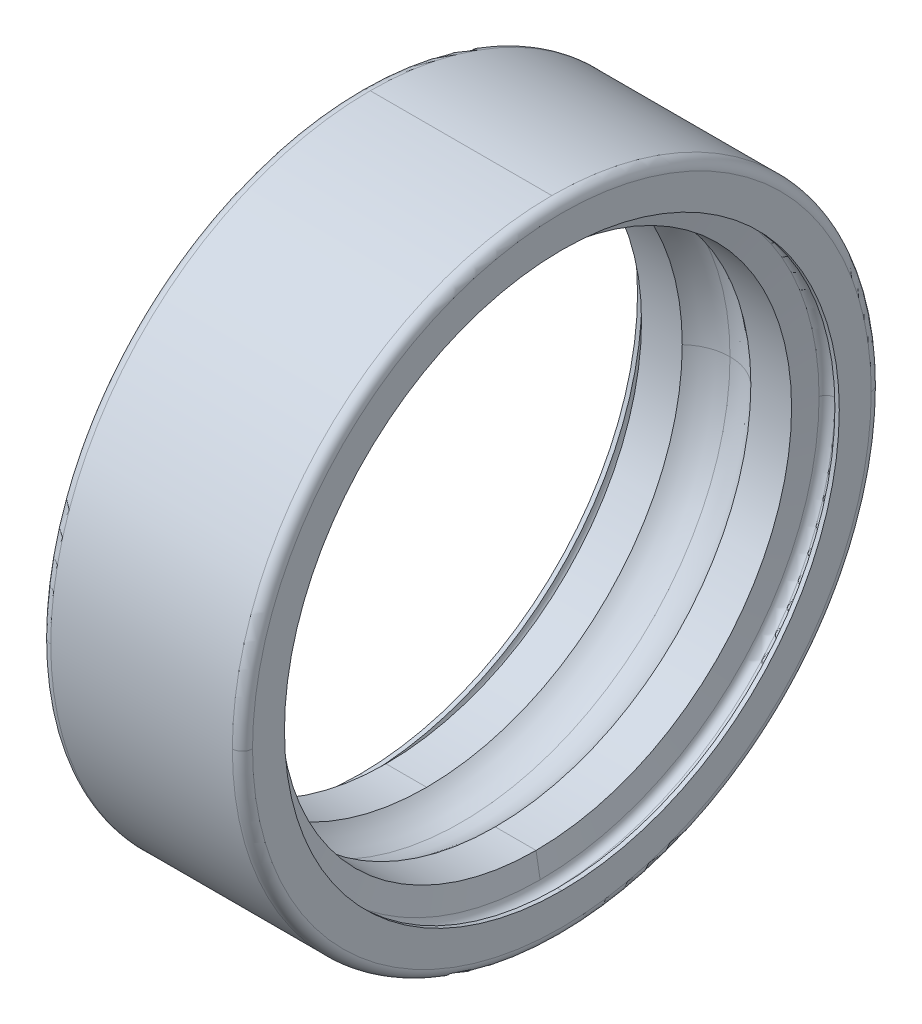
ISO-10303-21;
HEADER;
FILE_DESCRIPTION(('STEP AP214'),'2;1');
FILE_NAME('part.step','',(''),(''),'','','');
FILE_SCHEMA(('AUTOMOTIVE_DESIGN { 1 0 10303 214 1 1 1 1 }'));
ENDSEC;
DATA;
#1=APPLICATION_CONTEXT('core data for automotive mechanical design processes');
#2=APPLICATION_PROTOCOL_DEFINITION('international standard','automotive_design',2000,#1);
#3=PRODUCT_CONTEXT('',#1,'mechanical');
#4=PRODUCT('Part','Part','',(#3));
#5=PRODUCT_RELATED_PRODUCT_CATEGORY('part','',(#4));
#6=PRODUCT_DEFINITION_FORMATION('','',#4);
#7=PRODUCT_DEFINITION_CONTEXT('part definition',#1,'design');
#8=PRODUCT_DEFINITION('design','',#6,#7);
#9=PRODUCT_DEFINITION_SHAPE('','',#8);
#10=(LENGTH_UNIT() NAMED_UNIT(*) SI_UNIT(.MILLI.,.METRE.));
#11=(NAMED_UNIT(*) PLANE_ANGLE_UNIT() SI_UNIT($,.RADIAN.));
#12=(NAMED_UNIT(*) SI_UNIT($,.STERADIAN.) SOLID_ANGLE_UNIT());
#13=UNCERTAINTY_MEASURE_WITH_UNIT(LENGTH_MEASURE(1.E-05),#10,'distance_accuracy_value','');
#14=(GEOMETRIC_REPRESENTATION_CONTEXT(3) GLOBAL_UNCERTAINTY_ASSIGNED_CONTEXT((#13)) GLOBAL_UNIT_ASSIGNED_CONTEXT((#10,
#11,#12)) REPRESENTATION_CONTEXT('',''));
#15=CARTESIAN_POINT('',(0.,0.,0.));
#16=DIRECTION('',(0.,0.,1.));
#17=DIRECTION('',(1.,0.,0.));
#18=AXIS2_PLACEMENT_3D('',#15,#16,#17);
#19=CARTESIAN_POINT('',(5.61,0.,0.));
#20=DIRECTION('',(1.,0.,0.));
#21=DIRECTION('',(0.,0.,-1.));
#22=AXIS2_PLACEMENT_3D('',#19,#20,#21);
#23=TOROIDAL_SURFACE('',#22,8.25,0.26);
#24=CARTESIAN_POINT('',(5.61,0.,0.));
#25=DIRECTION('',(1.,0.,0.));
#26=DIRECTION('',(0.,0.,1.));
#27=AXIS2_PLACEMENT_3D('',#24,#25,#26);
#28=CIRCLE('',#27,8.51);
#29=CARTESIAN_POINT('',(5.61,0.,-8.51));
#30=VERTEX_POINT('',#29);
#31=CARTESIAN_POINT('',(5.61,0.,8.51));
#32=VERTEX_POINT('',#31);
#33=EDGE_CURVE('E185',#30,#32,#28,.T.);
#34=ORIENTED_EDGE('',*,*,#33,.T.);
#35=CARTESIAN_POINT('',(5.61,0.,8.25));
#36=DIRECTION('',(0.,-1.,0.));
#37=DIRECTION('',(0.,0.,1.));
#38=AXIS2_PLACEMENT_3D('',#35,#36,#37);
#39=CIRCLE('',#38,0.26);
#40=CARTESIAN_POINT('',(5.35394998421683,0.,8.2951485261934));
#41=VERTEX_POINT('',#40);
#42=EDGE_CURVE('E198',#32,#41,#39,.T.);
#43=ORIENTED_EDGE('',*,*,#42,.T.);
#44=CARTESIAN_POINT('',(5.35394998421683,0.,0.));
#45=DIRECTION('',(1.,0.,0.));
#46=DIRECTION('',(0.,1.,0.));
#47=AXIS2_PLACEMENT_3D('',#44,#45,#46);
#48=CIRCLE('',#47,8.2951485261934);
#49=CARTESIAN_POINT('',(5.35394998421683,8.2951485261934,0.));
#50=VERTEX_POINT('',#49);
#51=EDGE_CURVE('E32',#50,#41,#48,.T.);
#52=ORIENTED_EDGE('',*,*,#51,.F.);
#53=CARTESIAN_POINT('',(5.35394998421683,0.,0.));
#54=DIRECTION('',(1.,0.,0.));
#55=DIRECTION('',(0.,1.,0.));
#56=AXIS2_PLACEMENT_3D('',#53,#54,#55);
#57=CIRCLE('',#56,8.2951485261934);
#58=CARTESIAN_POINT('',(5.35394998421683,0.,-8.2951485261934));
#59=VERTEX_POINT('',#58);
#60=EDGE_CURVE('E186',#59,#50,#57,.T.);
#61=ORIENTED_EDGE('',*,*,#60,.F.);
#62=CARTESIAN_POINT('',(5.61,0.,-8.25));
#63=DIRECTION('',(0.,-1.,0.));
#64=DIRECTION('',(0.,0.,-1.));
#65=AXIS2_PLACEMENT_3D('',#62,#63,#64);
#66=CIRCLE('',#65,0.26);
#67=EDGE_CURVE('E182',#59,#30,#66,.T.);
#68=ORIENTED_EDGE('',*,*,#67,.T.);
#69=EDGE_LOOP('',(#34,#43,#52,#61,#68));
#70=FACE_BOUND('',#69,.T.);
#71=ADVANCED_FACE('F17',(#70),#23,.F.);
#72=CARTESIAN_POINT('',(5.935,0.,0.));
#73=DIRECTION('',(1.,0.,0.));
#74=DIRECTION('',(0.,1.,0.));
#75=AXIS2_PLACEMENT_3D('',#72,#73,#74);
#76=CYLINDRICAL_SURFACE('',#75,8.25);
#77=DIRECTION('',(1.,0.,0.));
#78=VECTOR('',#77,1.);
#79=CARTESIAN_POINT('',(5.935,8.25,0.));
#80=LINE('',#79,#78);
#81=CARTESIAN_POINT('',(5.87,8.25,0.));
#82=VERTEX_POINT('',#81);
#83=CARTESIAN_POINT('',(6.,8.25,0.));
#84=VERTEX_POINT('',#83);
#85=EDGE_CURVE('E328',#82,#84,#80,.T.);
#86=ORIENTED_EDGE('',*,*,#85,.T.);
#87=CARTESIAN_POINT('',(6.,0.,0.));
#88=DIRECTION('',(1.,0.,0.));
#89=DIRECTION('',(0.,1.,0.));
#90=AXIS2_PLACEMENT_3D('',#87,#88,#89);
#91=CIRCLE('',#90,8.25);
#92=CARTESIAN_POINT('',(6.,-8.25,0.));
#93=VERTEX_POINT('',#92);
#94=EDGE_CURVE('E11',#84,#93,#91,.T.);
#95=ORIENTED_EDGE('',*,*,#94,.T.);
#96=DIRECTION('',(-1.,0.,0.));
#97=VECTOR('',#96,1.);
#98=CARTESIAN_POINT('',(5.935,-8.25,0.));
#99=LINE('',#98,#97);
#100=CARTESIAN_POINT('',(5.87,-8.25,0.));
#101=VERTEX_POINT('',#100);
#102=EDGE_CURVE('E335',#93,#101,#99,.T.);
#103=ORIENTED_EDGE('',*,*,#102,.T.);
#104=CARTESIAN_POINT('',(5.87,0.,0.));
#105=DIRECTION('',(1.,0.,0.));
#106=DIRECTION('',(0.,1.,0.));
#107=AXIS2_PLACEMENT_3D('',#104,#105,#106);
#108=CIRCLE('',#107,8.25);
#109=CARTESIAN_POINT('',(5.87,0.,8.25));
#110=VERTEX_POINT('',#109);
#111=EDGE_CURVE('E202',#110,#101,#108,.T.);
#112=ORIENTED_EDGE('',*,*,#111,.F.);
#113=CARTESIAN_POINT('',(5.87,0.,0.));
#114=DIRECTION('',(1.,0.,0.));
#115=DIRECTION('',(0.,1.,0.));
#116=AXIS2_PLACEMENT_3D('',#113,#114,#115);
#117=CIRCLE('',#116,8.25);
#118=EDGE_CURVE('E239',#82,#110,#117,.T.);
#119=ORIENTED_EDGE('',*,*,#118,.F.);
#120=EDGE_LOOP('',(#86,#95,#103,#112,#119));
#121=FACE_BOUND('',#120,.T.);
#122=ADVANCED_FACE('F421',(#121),#76,.F.);
#123=CARTESIAN_POINT('',(6.,8.725,0.));
#124=DIRECTION('',(1.,0.,0.));
#125=DIRECTION('',(0.,1.,0.));
#126=AXIS2_PLACEMENT_3D('',#123,#124,#125);
#127=PLANE('',#126);
#128=ORIENTED_EDGE('',*,*,#94,.F.);
#129=CARTESIAN_POINT('',(6.,0.,0.));
#130=DIRECTION('',(1.,0.,0.));
#131=DIRECTION('',(0.,1.,0.));
#132=AXIS2_PLACEMENT_3D('',#129,#130,#131);
#133=CIRCLE('',#132,8.25);
#134=EDGE_CURVE('E339',#93,#84,#133,.T.);
#135=ORIENTED_EDGE('',*,*,#134,.F.);
#136=EDGE_LOOP('',(#128,#135));
#137=FACE_BOUND('',#136,.T.);
#138=CARTESIAN_POINT('',(6.,0.,0.));
#139=DIRECTION('',(1.,0.,0.));
#140=DIRECTION('',(0.,1.,0.));
#141=AXIS2_PLACEMENT_3D('',#138,#139,#140);
#142=CIRCLE('',#141,9.2);
#143=CARTESIAN_POINT('',(6.,0.,9.2));
#144=VERTEX_POINT('',#143);
#145=CARTESIAN_POINT('',(6.,0.,-9.2));
#146=VERTEX_POINT('',#145);
#147=EDGE_CURVE('E20',#144,#146,#142,.T.);
#148=ORIENTED_EDGE('',*,*,#147,.T.);
#149=CARTESIAN_POINT('',(6.,0.,0.));
#150=DIRECTION('',(1.,0.,0.));
#151=DIRECTION('',(0.,1.,0.));
#152=AXIS2_PLACEMENT_3D('',#149,#150,#151);
#153=CIRCLE('',#152,9.2);
#154=EDGE_CURVE('E258',#146,#144,#153,.T.);
#155=ORIENTED_EDGE('',*,*,#154,.T.);
#156=EDGE_LOOP('',(#148,#155));
#157=FACE_BOUND('',#156,.T.);
#158=ADVANCED_FACE('F404',(#137,#157),#127,.T.);
#159=CARTESIAN_POINT('',(5.7,0.,0.));
#160=DIRECTION('',(1.,0.,0.));
#161=DIRECTION('',(0.,0.,-1.));
#162=AXIS2_PLACEMENT_3D('',#159,#160,#161);
#163=TOROIDAL_SURFACE('',#162,9.2,0.3);
#164=CARTESIAN_POINT('',(5.7,0.,-9.2));
#165=DIRECTION('',(0.,-1.,0.));
#166=DIRECTION('',(0.,0.,-1.));
#167=AXIS2_PLACEMENT_3D('',#164,#165,#166);
#168=CIRCLE('',#167,0.3);
#169=CARTESIAN_POINT('',(5.7,0.,-9.5));
#170=VERTEX_POINT('',#169);
#171=EDGE_CURVE('E237',#170,#146,#168,.T.);
#172=ORIENTED_EDGE('',*,*,#171,.T.);
#173=ORIENTED_EDGE('',*,*,#147,.F.);
#174=CARTESIAN_POINT('',(5.7,0.,9.2));
#175=DIRECTION('',(0.,-1.,0.));
#176=DIRECTION('',(0.,0.,1.));
#177=AXIS2_PLACEMENT_3D('',#174,#175,#176);
#178=CIRCLE('',#177,0.3);
#179=CARTESIAN_POINT('',(5.7,0.,9.5));
#180=VERTEX_POINT('',#179);
#181=EDGE_CURVE('E245',#144,#180,#178,.T.);
#182=ORIENTED_EDGE('',*,*,#181,.T.);
#183=CARTESIAN_POINT('',(5.7,0.,0.));
#184=DIRECTION('',(1.,0.,0.));
#185=DIRECTION('',(0.,1.,0.));
#186=AXIS2_PLACEMENT_3D('',#183,#184,#185);
#187=CIRCLE('',#186,9.5);
#188=CARTESIAN_POINT('',(5.7,-9.5,0.));
#189=VERTEX_POINT('',#188);
#190=EDGE_CURVE('E357',#180,#189,#187,.T.);
#191=ORIENTED_EDGE('',*,*,#190,.T.);
#192=CARTESIAN_POINT('',(5.7,0.,0.));
#193=DIRECTION('',(1.,0.,0.));
#194=DIRECTION('',(0.,1.,0.));
#195=AXIS2_PLACEMENT_3D('',#192,#193,#194);
#196=CIRCLE('',#195,9.5);
#197=EDGE_CURVE('E378',#189,#170,#196,.T.);
#198=ORIENTED_EDGE('',*,*,#197,.T.);
#199=EDGE_LOOP('',(#172,#173,#182,#191,#198));
#200=FACE_BOUND('',#199,.T.);
#201=ADVANCED_FACE('F409',(#200),#163,.T.);
#202=CARTESIAN_POINT('',(3.,0.,0.));
#203=DIRECTION('',(1.,0.,0.));
#204=DIRECTION('',(0.,1.,0.));
#205=AXIS2_PLACEMENT_3D('',#202,#203,#204);
#206=CYLINDRICAL_SURFACE('',#205,9.5);
#207=DIRECTION('',(1.,0.,0.));
#208=VECTOR('',#207,1.);
#209=CARTESIAN_POINT('',(3.,9.5,0.));
#210=LINE('',#209,#208);
#211=CARTESIAN_POINT('',(0.3,9.5,0.));
#212=VERTEX_POINT('',#211);
#213=CARTESIAN_POINT('',(5.7,9.5,0.));
#214=VERTEX_POINT('',#213);
#215=EDGE_CURVE('E346',#212,#214,#210,.T.);
#216=ORIENTED_EDGE('',*,*,#215,.T.);
#217=CARTESIAN_POINT('',(5.7,0.,0.));
#218=DIRECTION('',(1.,0.,0.));
#219=DIRECTION('',(0.,1.,0.));
#220=AXIS2_PLACEMENT_3D('',#217,#218,#219);
#221=CIRCLE('',#220,9.5);
#222=EDGE_CURVE('E233',#170,#214,#221,.T.);
#223=ORIENTED_EDGE('',*,*,#222,.F.);
#224=ORIENTED_EDGE('',*,*,#197,.F.);
#225=DIRECTION('',(-1.,0.,0.));
#226=VECTOR('',#225,1.);
#227=CARTESIAN_POINT('',(3.,-9.5,0.));
#228=LINE('',#227,#226);
#229=CARTESIAN_POINT('',(0.3,-9.5,0.));
#230=VERTEX_POINT('',#229);
#231=EDGE_CURVE('E353',#189,#230,#228,.T.);
#232=ORIENTED_EDGE('',*,*,#231,.T.);
#233=CARTESIAN_POINT('',(0.3,0.,0.));
#234=DIRECTION('',(1.,0.,0.));
#235=DIRECTION('',(0.,1.,0.));
#236=AXIS2_PLACEMENT_3D('',#233,#234,#235);
#237=CIRCLE('',#236,9.5);
#238=CARTESIAN_POINT('',(0.3,0.,-9.5));
#239=VERTEX_POINT('',#238);
#240=EDGE_CURVE('E376',#230,#239,#237,.T.);
#241=ORIENTED_EDGE('',*,*,#240,.T.);
#242=CARTESIAN_POINT('',(0.3,0.,0.));
#243=DIRECTION('',(1.,0.,0.));
#244=DIRECTION('',(0.,1.,0.));
#245=AXIS2_PLACEMENT_3D('',#242,#243,#244);
#246=CIRCLE('',#245,9.5);
#247=EDGE_CURVE('E370',#239,#212,#246,.T.);
#248=ORIENTED_EDGE('',*,*,#247,.T.);
#249=EDGE_LOOP('',(#216,#223,#224,#232,#241,#248));
#250=FACE_BOUND('',#249,.T.);
#251=ADVANCED_FACE('F411',(#250),#206,.T.);
#252=CARTESIAN_POINT('',(0.3,0.,0.));
#253=DIRECTION('',(1.,0.,0.));
#254=DIRECTION('',(0.,0.,-1.));
#255=AXIS2_PLACEMENT_3D('',#252,#253,#254);
#256=TOROIDAL_SURFACE('',#255,9.2,0.3);
#257=CARTESIAN_POINT('',(0.3,0.,-9.2));
#258=DIRECTION('',(0.,-1.,0.));
#259=DIRECTION('',(0.,0.,-1.));
#260=AXIS2_PLACEMENT_3D('',#257,#258,#259);
#261=CIRCLE('',#260,0.3);
#262=CARTESIAN_POINT('',(0.,0.,-9.2));
#263=VERTEX_POINT('',#262);
#264=EDGE_CURVE('E361',#263,#239,#261,.T.);
#265=ORIENTED_EDGE('',*,*,#264,.T.);
#266=ORIENTED_EDGE('',*,*,#240,.F.);
#267=CARTESIAN_POINT('',(0.3,0.,0.));
#268=DIRECTION('',(1.,0.,0.));
#269=DIRECTION('',(0.,1.,0.));
#270=AXIS2_PLACEMENT_3D('',#267,#268,#269);
#271=CIRCLE('',#270,9.5);
#272=CARTESIAN_POINT('',(0.3,0.,9.5));
#273=VERTEX_POINT('',#272);
#274=EDGE_CURVE('E351',#273,#230,#271,.T.);
#275=ORIENTED_EDGE('',*,*,#274,.F.);
#276=CARTESIAN_POINT('',(0.3,0.,9.2));
#277=DIRECTION('',(0.,-1.,0.));
#278=DIRECTION('',(0.,0.,1.));
#279=AXIS2_PLACEMENT_3D('',#276,#277,#278);
#280=CIRCLE('',#279,0.3);
#281=CARTESIAN_POINT('',(0.,0.,9.2));
#282=VERTEX_POINT('',#281);
#283=EDGE_CURVE('E367',#273,#282,#280,.T.);
#284=ORIENTED_EDGE('',*,*,#283,.T.);
#285=CARTESIAN_POINT('',(0.,0.,0.));
#286=DIRECTION('',(1.,0.,0.));
#287=DIRECTION('',(0.,1.,0.));
#288=AXIS2_PLACEMENT_3D('',#285,#286,#287);
#289=CIRCLE('',#288,9.2);
#290=EDGE_CURVE('E298',#282,#263,#289,.T.);
#291=ORIENTED_EDGE('',*,*,#290,.T.);
#292=EDGE_LOOP('',(#265,#266,#275,#284,#291));
#293=FACE_BOUND('',#292,.T.);
#294=ADVANCED_FACE('F418',(#293),#256,.T.);
#295=CARTESIAN_POINT('',(0.,8.725,0.));
#296=DIRECTION('',(-1.,0.,0.));
#297=DIRECTION('',(0.,0.,1.));
#298=AXIS2_PLACEMENT_3D('',#295,#296,#297);
#299=PLANE('',#298);
#300=CARTESIAN_POINT('',(0.,0.,0.));
#301=DIRECTION('',(1.,0.,0.));
#302=DIRECTION('',(0.,1.,0.));
#303=AXIS2_PLACEMENT_3D('',#300,#301,#302);
#304=CIRCLE('',#303,8.25);
#305=CARTESIAN_POINT('',(0.,8.25,0.));
#306=VERTEX_POINT('',#305);
#307=CARTESIAN_POINT('',(0.,-8.25,0.));
#308=VERTEX_POINT('',#307);
#309=EDGE_CURVE('E296',#306,#308,#304,.T.);
#310=ORIENTED_EDGE('',*,*,#309,.T.);
#311=CARTESIAN_POINT('',(0.,0.,0.));
#312=DIRECTION('',(1.,0.,0.));
#313=DIRECTION('',(0.,1.,0.));
#314=AXIS2_PLACEMENT_3D('',#311,#312,#313);
#315=CIRCLE('',#314,8.25);
#316=EDGE_CURVE('E280',#308,#306,#315,.T.);
#317=ORIENTED_EDGE('',*,*,#316,.T.);
#318=EDGE_LOOP('',(#310,#317));
#319=FACE_BOUND('',#318,.T.);
#320=CARTESIAN_POINT('',(0.,0.,0.));
#321=DIRECTION('',(1.,0.,0.));
#322=DIRECTION('',(0.,1.,0.));
#323=AXIS2_PLACEMENT_3D('',#320,#321,#322);
#324=CIRCLE('',#323,9.2);
#325=EDGE_CURVE('E364',#263,#282,#324,.T.);
#326=ORIENTED_EDGE('',*,*,#325,.F.);
#327=ORIENTED_EDGE('',*,*,#290,.F.);
#328=EDGE_LOOP('',(#326,#327));
#329=FACE_BOUND('',#328,.T.);
#330=ADVANCED_FACE('F436',(#319,#329),#299,.T.);
#331=CARTESIAN_POINT('',(0.065,0.,0.));
#332=DIRECTION('',(1.,0.,0.));
#333=DIRECTION('',(0.,1.,0.));
#334=AXIS2_PLACEMENT_3D('',#331,#332,#333);
#335=CYLINDRICAL_SURFACE('',#334,8.25);
#336=DIRECTION('',(1.,0.,0.));
#337=VECTOR('',#336,1.);
#338=CARTESIAN_POINT('',(0.065,8.25,0.));
#339=LINE('',#338,#337);
#340=CARTESIAN_POINT('',(0.13,8.25,0.));
#341=VERTEX_POINT('',#340);
#342=EDGE_CURVE('E284',#306,#341,#339,.T.);
#343=ORIENTED_EDGE('',*,*,#342,.T.);
#344=CARTESIAN_POINT('',(0.13,0.,0.));
#345=DIRECTION('',(1.,0.,0.));
#346=DIRECTION('',(0.,1.,0.));
#347=AXIS2_PLACEMENT_3D('',#344,#345,#346);
#348=CIRCLE('',#347,8.25);
#349=CARTESIAN_POINT('',(0.13,0.,8.25));
#350=VERTEX_POINT('',#349);
#351=EDGE_CURVE('E226',#341,#350,#348,.T.);
#352=ORIENTED_EDGE('',*,*,#351,.T.);
#353=CARTESIAN_POINT('',(0.13,0.,0.));
#354=DIRECTION('',(1.,0.,0.));
#355=DIRECTION('',(0.,1.,0.));
#356=AXIS2_PLACEMENT_3D('',#353,#354,#355);
#357=CIRCLE('',#356,8.25);
#358=CARTESIAN_POINT('',(0.13,-8.25,0.));
#359=VERTEX_POINT('',#358);
#360=EDGE_CURVE('E310',#350,#359,#357,.T.);
#361=ORIENTED_EDGE('',*,*,#360,.T.);
#362=DIRECTION('',(-1.,0.,0.));
#363=VECTOR('',#362,1.);
#364=CARTESIAN_POINT('',(0.065,-8.25,0.));
#365=LINE('',#364,#363);
#366=EDGE_CURVE('E283',#359,#308,#365,.T.);
#367=ORIENTED_EDGE('',*,*,#366,.T.);
#368=ORIENTED_EDGE('',*,*,#309,.F.);
#369=EDGE_LOOP('',(#343,#352,#361,#367,#368));
#370=FACE_BOUND('',#369,.T.);
#371=ADVANCED_FACE('F440',(#370),#335,.F.);
#372=CARTESIAN_POINT('',(0.39,0.,0.));
#373=DIRECTION('',(1.,0.,0.));
#374=DIRECTION('',(0.,0.,-1.));
#375=AXIS2_PLACEMENT_3D('',#372,#373,#374);
#376=TOROIDAL_SURFACE('',#375,8.25,0.26);
#377=CARTESIAN_POINT('',(0.39,0.,0.));
#378=DIRECTION('',(1.,0.,0.));
#379=DIRECTION('',(0.,0.,1.));
#380=AXIS2_PLACEMENT_3D('',#377,#378,#379);
#381=CIRCLE('',#380,8.51);
#382=CARTESIAN_POINT('',(0.39,0.,-8.51));
#383=VERTEX_POINT('',#382);
#384=CARTESIAN_POINT('',(0.39,0.,8.51));
#385=VERTEX_POINT('',#384);
#386=EDGE_CURVE('E260',#383,#385,#381,.T.);
#387=ORIENTED_EDGE('',*,*,#386,.T.);
#388=CARTESIAN_POINT('',(0.39,0.,8.25));
#389=DIRECTION('',(0.,-1.,0.));
#390=DIRECTION('',(0.,0.,1.));
#391=AXIS2_PLACEMENT_3D('',#388,#389,#390);
#392=CIRCLE('',#391,0.26);
#393=EDGE_CURVE('E306',#385,#350,#392,.T.);
#394=ORIENTED_EDGE('',*,*,#393,.T.);
#395=ORIENTED_EDGE('',*,*,#351,.F.);
#396=CARTESIAN_POINT('',(0.13,0.,0.));
#397=DIRECTION('',(1.,0.,0.));
#398=DIRECTION('',(0.,1.,0.));
#399=AXIS2_PLACEMENT_3D('',#396,#397,#398);
#400=CIRCLE('',#399,8.25);
#401=CARTESIAN_POINT('',(0.13,0.,-8.25));
#402=VERTEX_POINT('',#401);
#403=EDGE_CURVE('E299',#402,#341,#400,.T.);
#404=ORIENTED_EDGE('',*,*,#403,.F.);
#405=CARTESIAN_POINT('',(0.39,0.,-8.25));
#406=DIRECTION('',(0.,-1.,0.));
#407=DIRECTION('',(0.,0.,-1.));
#408=AXIS2_PLACEMENT_3D('',#405,#406,#407);
#409=CIRCLE('',#408,0.26);
#410=EDGE_CURVE('E302',#402,#383,#409,.T.);
#411=ORIENTED_EDGE('',*,*,#410,.T.);
#412=EDGE_LOOP('',(#387,#394,#395,#404,#411));
#413=FACE_BOUND('',#412,.T.);
#414=ADVANCED_FACE('F442',(#413),#376,.F.);
#415=CARTESIAN_POINT('',(0.707336736166986,0.,0.));
#416=DIRECTION('',(-1.,0.,0.));
#417=DIRECTION('',(0.,1.,0.));
#418=AXIS2_PLACEMENT_3D('',#415,#416,#417);
#419=CONICAL_SURFACE('',#418,7.9475742630967,1.39626340159546);
#420=DIRECTION('',(0.173648177666931,-0.984807753012208,0.));
#421=VECTOR('',#420,1.);
#422=CARTESIAN_POINT('',(0.707336736166986,7.9475742630967,0.));
#423=LINE('',#422,#421);
#424=CARTESIAN_POINT('',(0.646050015783174,8.2951485261934,0.));
#425=VERTEX_POINT('',#424);
#426=CARTESIAN_POINT('',(0.768623456550796,7.6,0.));
#427=VERTEX_POINT('',#426);
#428=EDGE_CURVE('E309',#425,#427,#423,.T.);
#429=ORIENTED_EDGE('',*,*,#428,.T.);
#430=CARTESIAN_POINT('',(0.768623456550796,0.,0.));
#431=DIRECTION('',(1.,0.,0.));
#432=DIRECTION('',(0.,1.,0.));
#433=AXIS2_PLACEMENT_3D('',#430,#431,#432);
#434=CIRCLE('',#433,7.6);
#435=CARTESIAN_POINT('',(0.768623456550796,-7.6,0.));
#436=VERTEX_POINT('',#435);
#437=EDGE_CURVE('E225',#427,#436,#434,.T.);
#438=ORIENTED_EDGE('',*,*,#437,.T.);
#439=DIRECTION('',(-0.173648177666931,-0.984807753012208,0.));
#440=VECTOR('',#439,1.);
#441=CARTESIAN_POINT('',(0.707336736166986,-7.9475742630967,0.));
#442=LINE('',#441,#440);
#443=CARTESIAN_POINT('',(0.646050015783174,-8.2951485261934,0.));
#444=VERTEX_POINT('',#443);
#445=EDGE_CURVE('E317',#436,#444,#442,.T.);
#446=ORIENTED_EDGE('',*,*,#445,.T.);
#447=CARTESIAN_POINT('',(0.646050015783174,0.,0.));
#448=DIRECTION('',(1.,0.,0.));
#449=DIRECTION('',(0.,1.,0.));
#450=AXIS2_PLACEMENT_3D('',#447,#448,#449);
#451=CIRCLE('',#450,8.2951485261934);
#452=CARTESIAN_POINT('',(0.646050015783174,0.,8.2951485261934));
#453=VERTEX_POINT('',#452);
#454=EDGE_CURVE('E295',#453,#444,#451,.T.);
#455=ORIENTED_EDGE('',*,*,#454,.F.);
#456=CARTESIAN_POINT('',(0.646050015783174,0.,0.));
#457=DIRECTION('',(1.,0.,0.));
#458=DIRECTION('',(0.,1.,0.));
#459=AXIS2_PLACEMENT_3D('',#456,#457,#458);
#460=CIRCLE('',#459,8.2951485261934);
#461=EDGE_CURVE('E269',#425,#453,#460,.T.);
#462=ORIENTED_EDGE('',*,*,#461,.F.);
#463=EDGE_LOOP('',(#429,#438,#446,#455,#462));
#464=FACE_BOUND('',#463,.T.);
#465=ADVANCED_FACE('F445',(#464),#419,.F.);
#466=CARTESIAN_POINT('',(1.37440977691612,0.,0.));
#467=DIRECTION('',(1.,0.,0.));
#468=DIRECTION('',(0.,1.,0.));
#469=AXIS2_PLACEMENT_3D('',#466,#467,#468);
#470=CYLINDRICAL_SURFACE('',#469,7.6);
#471=DIRECTION('',(1.,0.,0.));
#472=VECTOR('',#471,1.);
#473=CARTESIAN_POINT('',(1.37440977691612,7.6,0.));
#474=LINE('',#473,#472);
#475=CARTESIAN_POINT('',(1.98019609728144,7.6,0.));
#476=VERTEX_POINT('',#475);
#477=EDGE_CURVE('E322',#427,#476,#474,.T.);
#478=ORIENTED_EDGE('',*,*,#477,.T.);
#479=CARTESIAN_POINT('',(1.98019609728144,0.,0.));
#480=DIRECTION('',(1.,0.,0.));
#481=DIRECTION('',(0.,1.,0.));
#482=AXIS2_PLACEMENT_3D('',#479,#480,#481);
#483=CIRCLE('',#482,7.6);
#484=CARTESIAN_POINT('',(1.98019609728144,0.,7.6));
#485=VERTEX_POINT('',#484);
#486=EDGE_CURVE('E227',#476,#485,#483,.T.);
#487=ORIENTED_EDGE('',*,*,#486,.T.);
#488=CARTESIAN_POINT('',(1.98019609728144,0.,0.));
#489=DIRECTION('',(1.,0.,0.));
#490=DIRECTION('',(0.,1.,0.));
#491=AXIS2_PLACEMENT_3D('',#488,#489,#490);
#492=CIRCLE('',#491,7.6);
#493=CARTESIAN_POINT('',(1.98019609728144,-7.6,0.));
#494=VERTEX_POINT('',#493);
#495=EDGE_CURVE('E254',#485,#494,#492,.T.);
#496=ORIENTED_EDGE('',*,*,#495,.T.);
#497=DIRECTION('',(-1.,0.,0.));
#498=VECTOR('',#497,1.);
#499=CARTESIAN_POINT('',(1.37440977691612,-7.6,0.));
#500=LINE('',#499,#498);
#501=EDGE_CURVE('E332',#494,#436,#500,.T.);
#502=ORIENTED_EDGE('',*,*,#501,.T.);
#503=ORIENTED_EDGE('',*,*,#437,.F.);
#504=EDGE_LOOP('',(#478,#487,#496,#502,#503));
#505=FACE_BOUND('',#504,.T.);
#506=ADVANCED_FACE('F449',(#505),#470,.F.);
#507=CARTESIAN_POINT('',(3.,0.,0.));
#508=DIRECTION('',(1.,0.,0.));
#509=DIRECTION('',(0.,0.,-1.));
#510=AXIS2_PLACEMENT_3D('',#507,#508,#509);
#511=TOROIDAL_SURFACE('',#510,6.5,1.5);
#512=CARTESIAN_POINT('',(3.,0.,0.));
#513=DIRECTION('',(1.,0.,0.));
#514=DIRECTION('',(0.,0.,1.));
#515=AXIS2_PLACEMENT_3D('',#512,#513,#514);
#516=CIRCLE('',#515,8.);
#517=CARTESIAN_POINT('',(3.,0.,-8.));
#518=VERTEX_POINT('',#517);
#519=CARTESIAN_POINT('',(3.,0.,8.));
#520=VERTEX_POINT('',#519);
#521=EDGE_CURVE('E251',#518,#520,#516,.T.);
#522=ORIENTED_EDGE('',*,*,#521,.T.);
#523=CARTESIAN_POINT('',(3.,0.,6.5));
#524=DIRECTION('',(0.,-1.,0.));
#525=DIRECTION('',(0.,0.,1.));
#526=AXIS2_PLACEMENT_3D('',#523,#524,#525);
#527=CIRCLE('',#526,1.5);
#528=EDGE_CURVE('E388',#520,#485,#527,.T.);
#529=ORIENTED_EDGE('',*,*,#528,.T.);
#530=ORIENTED_EDGE('',*,*,#486,.F.);
#531=CARTESIAN_POINT('',(1.98019609728144,0.,0.));
#532=DIRECTION('',(1.,0.,0.));
#533=DIRECTION('',(0.,1.,0.));
#534=AXIS2_PLACEMENT_3D('',#531,#532,#533);
#535=CIRCLE('',#534,7.6);
#536=CARTESIAN_POINT('',(1.98019609728144,0.,-7.6));
#537=VERTEX_POINT('',#536);
#538=EDGE_CURVE('E255',#537,#476,#535,.T.);
#539=ORIENTED_EDGE('',*,*,#538,.F.);
#540=CARTESIAN_POINT('',(3.,0.,-6.5));
#541=DIRECTION('',(0.,-1.,0.));
#542=DIRECTION('',(0.,0.,-1.));
#543=AXIS2_PLACEMENT_3D('',#540,#541,#542);
#544=CIRCLE('',#543,1.5);
#545=EDGE_CURVE('E252',#537,#518,#544,.T.);
#546=ORIENTED_EDGE('',*,*,#545,.T.);
#547=EDGE_LOOP('',(#522,#529,#530,#539,#546));
#548=FACE_BOUND('',#547,.T.);
#549=ADVANCED_FACE('F453',(#548),#511,.F.);
#550=CARTESIAN_POINT('',(4.62559022308388,0.,0.));
#551=DIRECTION('',(1.,0.,0.));
#552=DIRECTION('',(0.,1.,0.));
#553=AXIS2_PLACEMENT_3D('',#550,#551,#552);
#554=CYLINDRICAL_SURFACE('',#553,7.6);
#555=DIRECTION('',(1.,0.,0.));
#556=VECTOR('',#555,1.);
#557=CARTESIAN_POINT('',(4.62559022308388,7.6,0.));
#558=LINE('',#557,#556);
#559=CARTESIAN_POINT('',(4.01980390271856,7.6,0.));
#560=VERTEX_POINT('',#559);
#561=CARTESIAN_POINT('',(5.2313765434492,7.6,0.));
#562=VERTEX_POINT('',#561);
#563=EDGE_CURVE('E315',#560,#562,#558,.T.);
#564=ORIENTED_EDGE('',*,*,#563,.T.);
#565=CARTESIAN_POINT('',(5.2313765434492,0.,0.));
#566=DIRECTION('',(1.,0.,0.));
#567=DIRECTION('',(0.,1.,0.));
#568=AXIS2_PLACEMENT_3D('',#565,#566,#567);
#569=CIRCLE('',#568,7.6);
#570=CARTESIAN_POINT('',(5.2313765434492,-7.6,0.));
#571=VERTEX_POINT('',#570);
#572=EDGE_CURVE('E40',#562,#571,#569,.T.);
#573=ORIENTED_EDGE('',*,*,#572,.T.);
#574=DIRECTION('',(-1.,0.,0.));
#575=VECTOR('',#574,1.);
#576=CARTESIAN_POINT('',(4.62559022308388,-7.6,0.));
#577=LINE('',#576,#575);
#578=CARTESIAN_POINT('',(4.01980390271856,-7.6,0.));
#579=VERTEX_POINT('',#578);
#580=EDGE_CURVE('E312',#571,#579,#577,.T.);
#581=ORIENTED_EDGE('',*,*,#580,.T.);
#582=CARTESIAN_POINT('',(4.01980390271856,0.,0.));
#583=DIRECTION('',(1.,0.,0.));
#584=DIRECTION('',(0.,1.,0.));
#585=AXIS2_PLACEMENT_3D('',#582,#583,#584);
#586=CIRCLE('',#585,7.6);
#587=CARTESIAN_POINT('',(4.01980390271856,0.,7.6));
#588=VERTEX_POINT('',#587);
#589=EDGE_CURVE('E279',#588,#579,#586,.T.);
#590=ORIENTED_EDGE('',*,*,#589,.F.);
#591=CARTESIAN_POINT('',(4.01980390271856,0.,0.));
#592=DIRECTION('',(1.,0.,0.));
#593=DIRECTION('',(0.,1.,0.));
#594=AXIS2_PLACEMENT_3D('',#591,#592,#593);
#595=CIRCLE('',#594,7.6);
#596=EDGE_CURVE('E223',#560,#588,#595,.T.);
#597=ORIENTED_EDGE('',*,*,#596,.F.);
#598=EDGE_LOOP('',(#564,#573,#581,#590,#597));
#599=FACE_BOUND('',#598,.T.);
#600=ADVANCED_FACE('F455',(#599),#554,.F.);
#601=CARTESIAN_POINT('',(5.29266326383301,0.,0.));
#602=DIRECTION('',(1.,0.,0.));
#603=DIRECTION('',(0.,1.,0.));
#604=AXIS2_PLACEMENT_3D('',#601,#602,#603);
#605=CONICAL_SURFACE('',#604,7.9475742630967,1.39626340159546);
#606=DIRECTION('',(0.173648177666931,0.984807753012208,0.));
#607=VECTOR('',#606,1.);
#608=CARTESIAN_POINT('',(5.29266326383301,7.9475742630967,0.));
#609=LINE('',#608,#607);
#610=EDGE_CURVE('E394',#562,#50,#609,.T.);
#611=ORIENTED_EDGE('',*,*,#610,.T.);
#612=ORIENTED_EDGE('',*,*,#51,.T.);
#613=CARTESIAN_POINT('',(5.35394998421683,0.,0.));
#614=DIRECTION('',(1.,0.,0.));
#615=DIRECTION('',(0.,1.,0.));
#616=AXIS2_PLACEMENT_3D('',#613,#614,#615);
#617=CIRCLE('',#616,8.2951485261934);
#618=CARTESIAN_POINT('',(5.35394998421683,-8.2951485261934,0.));
#619=VERTEX_POINT('',#618);
#620=EDGE_CURVE('E324',#41,#619,#617,.T.);
#621=ORIENTED_EDGE('',*,*,#620,.T.);
#622=DIRECTION('',(-0.173648177666931,0.984807753012208,0.));
#623=VECTOR('',#622,1.);
#624=CARTESIAN_POINT('',(5.29266326383301,-7.9475742630967,0.));
#625=LINE('',#624,#623);
#626=EDGE_CURVE('E248',#619,#571,#625,.T.);
#627=ORIENTED_EDGE('',*,*,#626,.T.);
#628=ORIENTED_EDGE('',*,*,#572,.F.);
#629=EDGE_LOOP('',(#611,#612,#621,#627,#628));
#630=FACE_BOUND('',#629,.T.);
#631=ADVANCED_FACE('F458',(#630),#605,.F.);
#632=CARTESIAN_POINT('',(5.29266326383301,0.,0.));
#633=DIRECTION('',(1.,0.,0.));
#634=DIRECTION('',(0.,1.,0.));
#635=AXIS2_PLACEMENT_3D('',#632,#633,#634);
#636=CONICAL_SURFACE('',#635,7.9475742630967,1.39626340159546);
#637=ORIENTED_EDGE('',*,*,#610,.F.);
#638=CARTESIAN_POINT('',(5.2313765434492,0.,0.));
#639=DIRECTION('',(1.,0.,0.));
#640=DIRECTION('',(0.,1.,0.));
#641=AXIS2_PLACEMENT_3D('',#638,#639,#640);
#642=CIRCLE('',#641,7.6);
#643=EDGE_CURVE('E314',#571,#562,#642,.T.);
#644=ORIENTED_EDGE('',*,*,#643,.F.);
#645=ORIENTED_EDGE('',*,*,#626,.F.);
#646=CARTESIAN_POINT('',(5.35394998421683,0.,0.));
#647=DIRECTION('',(1.,0.,0.));
#648=DIRECTION('',(0.,1.,0.));
#649=AXIS2_PLACEMENT_3D('',#646,#647,#648);
#650=CIRCLE('',#649,8.2951485261934);
#651=EDGE_CURVE('E190',#619,#59,#650,.T.);
#652=ORIENTED_EDGE('',*,*,#651,.T.);
#653=ORIENTED_EDGE('',*,*,#60,.T.);
#654=EDGE_LOOP('',(#637,#644,#645,#652,#653));
#655=FACE_BOUND('',#654,.T.);
#656=ADVANCED_FACE('F461',(#655),#636,.F.);
#657=CARTESIAN_POINT('',(4.62559022308388,0.,0.));
#658=DIRECTION('',(1.,0.,0.));
#659=DIRECTION('',(0.,1.,0.));
#660=AXIS2_PLACEMENT_3D('',#657,#658,#659);
#661=CYLINDRICAL_SURFACE('',#660,7.6);
#662=ORIENTED_EDGE('',*,*,#563,.F.);
#663=CARTESIAN_POINT('',(4.01980390271856,0.,0.));
#664=DIRECTION('',(1.,0.,0.));
#665=DIRECTION('',(0.,1.,0.));
#666=AXIS2_PLACEMENT_3D('',#663,#664,#665);
#667=CIRCLE('',#666,7.6);
#668=CARTESIAN_POINT('',(4.01980390271856,0.,-7.6));
#669=VERTEX_POINT('',#668);
#670=EDGE_CURVE('E220',#669,#560,#667,.T.);
#671=ORIENTED_EDGE('',*,*,#670,.F.);
#672=CARTESIAN_POINT('',(4.01980390271856,0.,0.));
#673=DIRECTION('',(1.,0.,0.));
#674=DIRECTION('',(0.,1.,0.));
#675=AXIS2_PLACEMENT_3D('',#672,#673,#674);
#676=CIRCLE('',#675,7.6);
#677=EDGE_CURVE('E287',#579,#669,#676,.T.);
#678=ORIENTED_EDGE('',*,*,#677,.F.);
#679=ORIENTED_EDGE('',*,*,#580,.F.);
#680=ORIENTED_EDGE('',*,*,#643,.T.);
#681=EDGE_LOOP('',(#662,#671,#678,#679,#680));
#682=FACE_BOUND('',#681,.T.);
#683=ADVANCED_FACE('F465',(#682),#661,.F.);
#684=CARTESIAN_POINT('',(3.,0.,0.));
#685=DIRECTION('',(1.,0.,0.));
#686=DIRECTION('',(0.,0.,-1.));
#687=AXIS2_PLACEMENT_3D('',#684,#685,#686);
#688=TOROIDAL_SURFACE('',#687,6.5,1.5);
#689=CARTESIAN_POINT('',(3.,0.,0.));
#690=DIRECTION('',(1.,0.,0.));
#691=DIRECTION('',(0.,0.,1.));
#692=AXIS2_PLACEMENT_3D('',#689,#690,#691);
#693=CIRCLE('',#692,8.);
#694=EDGE_CURVE('E242',#520,#518,#693,.T.);
#695=ORIENTED_EDGE('',*,*,#694,.T.);
#696=ORIENTED_EDGE('',*,*,#545,.F.);
#697=CARTESIAN_POINT('',(1.98019609728144,0.,0.));
#698=DIRECTION('',(1.,0.,0.));
#699=DIRECTION('',(0.,1.,0.));
#700=AXIS2_PLACEMENT_3D('',#697,#698,#699);
#701=CIRCLE('',#700,7.6);
#702=EDGE_CURVE('E329',#494,#537,#701,.T.);
#703=ORIENTED_EDGE('',*,*,#702,.F.);
#704=ORIENTED_EDGE('',*,*,#495,.F.);
#705=ORIENTED_EDGE('',*,*,#528,.F.);
#706=EDGE_LOOP('',(#695,#696,#703,#704,#705));
#707=FACE_BOUND('',#706,.T.);
#708=ADVANCED_FACE('F469',(#707),#688,.F.);
#709=CARTESIAN_POINT('',(1.37440977691612,0.,0.));
#710=DIRECTION('',(1.,0.,0.));
#711=DIRECTION('',(0.,1.,0.));
#712=AXIS2_PLACEMENT_3D('',#709,#710,#711);
#713=CYLINDRICAL_SURFACE('',#712,7.6);
#714=ORIENTED_EDGE('',*,*,#477,.F.);
#715=CARTESIAN_POINT('',(0.768623456550796,0.,0.));
#716=DIRECTION('',(1.,0.,0.));
#717=DIRECTION('',(0.,1.,0.));
#718=AXIS2_PLACEMENT_3D('',#715,#716,#717);
#719=CIRCLE('',#718,7.6);
#720=EDGE_CURVE('E318',#436,#427,#719,.T.);
#721=ORIENTED_EDGE('',*,*,#720,.F.);
#722=ORIENTED_EDGE('',*,*,#501,.F.);
#723=ORIENTED_EDGE('',*,*,#702,.T.);
#724=ORIENTED_EDGE('',*,*,#538,.T.);
#725=EDGE_LOOP('',(#714,#721,#722,#723,#724));
#726=FACE_BOUND('',#725,.T.);
#727=ADVANCED_FACE('F482',(#726),#713,.F.);
#728=CARTESIAN_POINT('',(0.707336736166986,0.,0.));
#729=DIRECTION('',(-1.,0.,0.));
#730=DIRECTION('',(0.,1.,0.));
#731=AXIS2_PLACEMENT_3D('',#728,#729,#730);
#732=CONICAL_SURFACE('',#731,7.9475742630967,1.39626340159546);
#733=ORIENTED_EDGE('',*,*,#428,.F.);
#734=CARTESIAN_POINT('',(0.646050015783174,0.,0.));
#735=DIRECTION('',(1.,0.,0.));
#736=DIRECTION('',(0.,1.,0.));
#737=AXIS2_PLACEMENT_3D('',#734,#735,#736);
#738=CIRCLE('',#737,8.2951485261934);
#739=CARTESIAN_POINT('',(0.646050015783174,0.,-8.2951485261934));
#740=VERTEX_POINT('',#739);
#741=EDGE_CURVE('E266',#740,#425,#738,.T.);
#742=ORIENTED_EDGE('',*,*,#741,.F.);
#743=CARTESIAN_POINT('',(0.646050015783174,0.,0.));
#744=DIRECTION('',(1.,0.,0.));
#745=DIRECTION('',(0.,1.,0.));
#746=AXIS2_PLACEMENT_3D('',#743,#744,#745);
#747=CIRCLE('',#746,8.2951485261934);
#748=EDGE_CURVE('E203',#444,#740,#747,.T.);
#749=ORIENTED_EDGE('',*,*,#748,.F.);
#750=ORIENTED_EDGE('',*,*,#445,.F.);
#751=ORIENTED_EDGE('',*,*,#720,.T.);
#752=EDGE_LOOP('',(#733,#742,#749,#750,#751));
#753=FACE_BOUND('',#752,.T.);
#754=ADVANCED_FACE('F493',(#753),#732,.F.);
#755=CARTESIAN_POINT('',(0.39,0.,0.));
#756=DIRECTION('',(1.,0.,0.));
#757=DIRECTION('',(0.,0.,-1.));
#758=AXIS2_PLACEMENT_3D('',#755,#756,#757);
#759=TOROIDAL_SURFACE('',#758,8.25,0.26);
#760=CARTESIAN_POINT('',(0.39,0.,0.));
#761=DIRECTION('',(1.,0.,0.));
#762=DIRECTION('',(0.,0.,1.));
#763=AXIS2_PLACEMENT_3D('',#760,#761,#762);
#764=CIRCLE('',#763,8.51);
#765=EDGE_CURVE('E292',#385,#383,#764,.T.);
#766=ORIENTED_EDGE('',*,*,#765,.T.);
#767=ORIENTED_EDGE('',*,*,#410,.F.);
#768=CARTESIAN_POINT('',(0.13,0.,0.));
#769=DIRECTION('',(1.,0.,0.));
#770=DIRECTION('',(0.,1.,0.));
#771=AXIS2_PLACEMENT_3D('',#768,#769,#770);
#772=CIRCLE('',#771,8.25);
#773=EDGE_CURVE('E290',#359,#402,#772,.T.);
#774=ORIENTED_EDGE('',*,*,#773,.F.);
#775=ORIENTED_EDGE('',*,*,#360,.F.);
#776=ORIENTED_EDGE('',*,*,#393,.F.);
#777=EDGE_LOOP('',(#766,#767,#774,#775,#776));
#778=FACE_BOUND('',#777,.T.);
#779=ADVANCED_FACE('F475',(#778),#759,.F.);
#780=CARTESIAN_POINT('',(0.065,0.,0.));
#781=DIRECTION('',(1.,0.,0.));
#782=DIRECTION('',(0.,1.,0.));
#783=AXIS2_PLACEMENT_3D('',#780,#781,#782);
#784=CYLINDRICAL_SURFACE('',#783,8.25);
#785=ORIENTED_EDGE('',*,*,#342,.F.);
#786=ORIENTED_EDGE('',*,*,#316,.F.);
#787=ORIENTED_EDGE('',*,*,#366,.F.);
#788=ORIENTED_EDGE('',*,*,#773,.T.);
#789=ORIENTED_EDGE('',*,*,#403,.T.);
#790=EDGE_LOOP('',(#785,#786,#787,#788,#789));
#791=FACE_BOUND('',#790,.T.);
#792=ADVANCED_FACE('F471',(#791),#784,.F.);
#793=CARTESIAN_POINT('',(0.3,0.,0.));
#794=DIRECTION('',(1.,0.,0.));
#795=DIRECTION('',(0.,0.,-1.));
#796=AXIS2_PLACEMENT_3D('',#793,#794,#795);
#797=TOROIDAL_SURFACE('',#796,9.2,0.3);
#798=ORIENTED_EDGE('',*,*,#264,.F.);
#799=ORIENTED_EDGE('',*,*,#325,.T.);
#800=ORIENTED_EDGE('',*,*,#283,.F.);
#801=CARTESIAN_POINT('',(0.3,0.,0.));
#802=DIRECTION('',(1.,0.,0.));
#803=DIRECTION('',(0.,1.,0.));
#804=AXIS2_PLACEMENT_3D('',#801,#802,#803);
#805=CIRCLE('',#804,9.5);
#806=EDGE_CURVE('E348',#212,#273,#805,.T.);
#807=ORIENTED_EDGE('',*,*,#806,.F.);
#808=ORIENTED_EDGE('',*,*,#247,.F.);
#809=EDGE_LOOP('',(#798,#799,#800,#807,#808));
#810=FACE_BOUND('',#809,.T.);
#811=ADVANCED_FACE('F474',(#810),#797,.T.);
#812=CARTESIAN_POINT('',(3.,0.,0.));
#813=DIRECTION('',(1.,0.,0.));
#814=DIRECTION('',(0.,1.,0.));
#815=AXIS2_PLACEMENT_3D('',#812,#813,#814);
#816=CYLINDRICAL_SURFACE('',#815,9.5);
#817=ORIENTED_EDGE('',*,*,#215,.F.);
#818=ORIENTED_EDGE('',*,*,#806,.T.);
#819=ORIENTED_EDGE('',*,*,#274,.T.);
#820=ORIENTED_EDGE('',*,*,#231,.F.);
#821=ORIENTED_EDGE('',*,*,#190,.F.);
#822=CARTESIAN_POINT('',(5.7,0.,0.));
#823=DIRECTION('',(1.,0.,0.));
#824=DIRECTION('',(0.,1.,0.));
#825=AXIS2_PLACEMENT_3D('',#822,#823,#824);
#826=CIRCLE('',#825,9.5);
#827=EDGE_CURVE('E236',#214,#180,#826,.T.);
#828=ORIENTED_EDGE('',*,*,#827,.F.);
#829=EDGE_LOOP('',(#817,#818,#819,#820,#821,#828));
#830=FACE_BOUND('',#829,.T.);
#831=ADVANCED_FACE('F486',(#830),#816,.T.);
#832=CARTESIAN_POINT('',(5.7,0.,0.));
#833=DIRECTION('',(1.,0.,0.));
#834=DIRECTION('',(0.,0.,-1.));
#835=AXIS2_PLACEMENT_3D('',#832,#833,#834);
#836=TOROIDAL_SURFACE('',#835,9.2,0.3);
#837=ORIENTED_EDGE('',*,*,#171,.F.);
#838=ORIENTED_EDGE('',*,*,#222,.T.);
#839=ORIENTED_EDGE('',*,*,#827,.T.);
#840=ORIENTED_EDGE('',*,*,#181,.F.);
#841=ORIENTED_EDGE('',*,*,#154,.F.);
#842=EDGE_LOOP('',(#837,#838,#839,#840,#841));
#843=FACE_BOUND('',#842,.T.);
#844=ADVANCED_FACE('F408',(#843),#836,.T.);
#845=CARTESIAN_POINT('',(5.935,0.,0.));
#846=DIRECTION('',(1.,0.,0.));
#847=DIRECTION('',(0.,1.,0.));
#848=AXIS2_PLACEMENT_3D('',#845,#846,#847);
#849=CYLINDRICAL_SURFACE('',#848,8.25);
#850=ORIENTED_EDGE('',*,*,#85,.F.);
#851=CARTESIAN_POINT('',(5.87,0.,0.));
#852=DIRECTION('',(1.,0.,0.));
#853=DIRECTION('',(0.,1.,0.));
#854=AXIS2_PLACEMENT_3D('',#851,#852,#853);
#855=CIRCLE('',#854,8.25);
#856=CARTESIAN_POINT('',(5.87,0.,-8.25));
#857=VERTEX_POINT('',#856);
#858=EDGE_CURVE('E213',#857,#82,#855,.T.);
#859=ORIENTED_EDGE('',*,*,#858,.F.);
#860=CARTESIAN_POINT('',(5.87,0.,0.));
#861=DIRECTION('',(1.,0.,0.));
#862=DIRECTION('',(0.,1.,0.));
#863=AXIS2_PLACEMENT_3D('',#860,#861,#862);
#864=CIRCLE('',#863,8.25);
#865=EDGE_CURVE('E191',#101,#857,#864,.T.);
#866=ORIENTED_EDGE('',*,*,#865,.F.);
#867=ORIENTED_EDGE('',*,*,#102,.F.);
#868=ORIENTED_EDGE('',*,*,#134,.T.);
#869=EDGE_LOOP('',(#850,#859,#866,#867,#868));
#870=FACE_BOUND('',#869,.T.);
#871=ADVANCED_FACE('F497',(#870),#849,.F.);
#872=CARTESIAN_POINT('',(5.61,0.,0.));
#873=DIRECTION('',(1.,0.,0.));
#874=DIRECTION('',(0.,0.,-1.));
#875=AXIS2_PLACEMENT_3D('',#872,#873,#874);
#876=TOROIDAL_SURFACE('',#875,8.25,0.26);
#877=CARTESIAN_POINT('',(5.61,0.,0.));
#878=DIRECTION('',(1.,0.,0.));
#879=DIRECTION('',(0.,0.,1.));
#880=AXIS2_PLACEMENT_3D('',#877,#878,#879);
#881=CIRCLE('',#880,8.51);
#882=EDGE_CURVE('E194',#32,#30,#881,.T.);
#883=ORIENTED_EDGE('',*,*,#882,.T.);
#884=ORIENTED_EDGE('',*,*,#67,.F.);
#885=ORIENTED_EDGE('',*,*,#651,.F.);
#886=ORIENTED_EDGE('',*,*,#620,.F.);
#887=ORIENTED_EDGE('',*,*,#42,.F.);
#888=EDGE_LOOP('',(#883,#884,#885,#886,#887));
#889=FACE_BOUND('',#888,.T.);
#890=ADVANCED_FACE('F196',(#889),#876,.F.);
#891=CARTESIAN_POINT('',(5.61,0.,0.));
#892=DIRECTION('',(1.,0.,0.));
#893=DIRECTION('',(0.,0.,-1.));
#894=AXIS2_PLACEMENT_3D('',#891,#892,#893);
#895=TOROIDAL_SURFACE('',#894,8.25,0.26);
#896=ORIENTED_EDGE('',*,*,#882,.F.);
#897=CARTESIAN_POINT('',(5.61,0.,8.25));
#898=DIRECTION('',(0.,-1.,0.));
#899=DIRECTION('',(0.,0.,1.));
#900=AXIS2_PLACEMENT_3D('',#897,#898,#899);
#901=CIRCLE('',#900,0.26);
#902=EDGE_CURVE('E217',#110,#32,#901,.T.);
#903=ORIENTED_EDGE('',*,*,#902,.F.);
#904=ORIENTED_EDGE('',*,*,#111,.T.);
#905=ORIENTED_EDGE('',*,*,#865,.T.);
#906=CARTESIAN_POINT('',(5.61,0.,-8.25));
#907=DIRECTION('',(0.,-1.,0.));
#908=DIRECTION('',(0.,0.,-1.));
#909=AXIS2_PLACEMENT_3D('',#906,#907,#908);
#910=CIRCLE('',#909,0.26);
#911=EDGE_CURVE('E206',#30,#857,#910,.T.);
#912=ORIENTED_EDGE('',*,*,#911,.F.);
#913=EDGE_LOOP('',(#896,#903,#904,#905,#912));
#914=FACE_BOUND('',#913,.T.);
#915=ADVANCED_FACE('F207',(#914),#895,.F.);
#916=CARTESIAN_POINT('',(0.39,0.,0.));
#917=DIRECTION('',(1.,0.,0.));
#918=DIRECTION('',(0.,0.,-1.));
#919=AXIS2_PLACEMENT_3D('',#916,#917,#918);
#920=TOROIDAL_SURFACE('',#919,8.25,0.26);
#921=ORIENTED_EDGE('',*,*,#765,.F.);
#922=CARTESIAN_POINT('',(0.39,0.,8.25));
#923=DIRECTION('',(0.,-1.,0.));
#924=DIRECTION('',(0.,0.,1.));
#925=AXIS2_PLACEMENT_3D('',#922,#923,#924);
#926=CIRCLE('',#925,0.26);
#927=EDGE_CURVE('E272',#453,#385,#926,.T.);
#928=ORIENTED_EDGE('',*,*,#927,.F.);
#929=ORIENTED_EDGE('',*,*,#454,.T.);
#930=ORIENTED_EDGE('',*,*,#748,.T.);
#931=CARTESIAN_POINT('',(0.39,0.,-8.25));
#932=DIRECTION('',(0.,-1.,0.));
#933=DIRECTION('',(0.,0.,-1.));
#934=AXIS2_PLACEMENT_3D('',#931,#932,#933);
#935=CIRCLE('',#934,0.26);
#936=EDGE_CURVE('E263',#383,#740,#935,.T.);
#937=ORIENTED_EDGE('',*,*,#936,.F.);
#938=EDGE_LOOP('',(#921,#928,#929,#930,#937));
#939=FACE_BOUND('',#938,.T.);
#940=ADVANCED_FACE('F501',(#939),#920,.F.);
#941=CARTESIAN_POINT('',(3.,0.,0.));
#942=DIRECTION('',(1.,0.,0.));
#943=DIRECTION('',(0.,0.,-1.));
#944=AXIS2_PLACEMENT_3D('',#941,#942,#943);
#945=TOROIDAL_SURFACE('',#944,6.5,1.5);
#946=ORIENTED_EDGE('',*,*,#694,.F.);
#947=CARTESIAN_POINT('',(3.,0.,6.5));
#948=DIRECTION('',(0.,-1.,0.));
#949=DIRECTION('',(0.,0.,1.));
#950=AXIS2_PLACEMENT_3D('',#947,#948,#949);
#951=CIRCLE('',#950,1.5);
#952=EDGE_CURVE('E232',#588,#520,#951,.T.);
#953=ORIENTED_EDGE('',*,*,#952,.F.);
#954=ORIENTED_EDGE('',*,*,#589,.T.);
#955=ORIENTED_EDGE('',*,*,#677,.T.);
#956=CARTESIAN_POINT('',(3.,0.,-6.5));
#957=DIRECTION('',(0.,-1.,0.));
#958=DIRECTION('',(0.,0.,-1.));
#959=AXIS2_PLACEMENT_3D('',#956,#957,#958);
#960=CIRCLE('',#959,1.5);
#961=EDGE_CURVE('E224',#518,#669,#960,.T.);
#962=ORIENTED_EDGE('',*,*,#961,.F.);
#963=EDGE_LOOP('',(#946,#953,#954,#955,#962));
#964=FACE_BOUND('',#963,.T.);
#965=ADVANCED_FACE('F506',(#964),#945,.F.);
#966=CARTESIAN_POINT('',(3.,0.,0.));
#967=DIRECTION('',(1.,0.,0.));
#968=DIRECTION('',(0.,0.,-1.));
#969=AXIS2_PLACEMENT_3D('',#966,#967,#968);
#970=TOROIDAL_SURFACE('',#969,6.5,1.5);
#971=ORIENTED_EDGE('',*,*,#521,.F.);
#972=ORIENTED_EDGE('',*,*,#961,.T.);
#973=ORIENTED_EDGE('',*,*,#670,.T.);
#974=ORIENTED_EDGE('',*,*,#596,.T.);
#975=ORIENTED_EDGE('',*,*,#952,.T.);
#976=EDGE_LOOP('',(#971,#972,#973,#974,#975));
#977=FACE_BOUND('',#976,.T.);
#978=ADVANCED_FACE('F518',(#977),#970,.F.);
#979=CARTESIAN_POINT('',(0.39,0.,0.));
#980=DIRECTION('',(1.,0.,0.));
#981=DIRECTION('',(0.,0.,-1.));
#982=AXIS2_PLACEMENT_3D('',#979,#980,#981);
#983=TOROIDAL_SURFACE('',#982,8.25,0.26);
#984=ORIENTED_EDGE('',*,*,#386,.F.);
#985=ORIENTED_EDGE('',*,*,#936,.T.);
#986=ORIENTED_EDGE('',*,*,#741,.T.);
#987=ORIENTED_EDGE('',*,*,#461,.T.);
#988=ORIENTED_EDGE('',*,*,#927,.T.);
#989=EDGE_LOOP('',(#984,#985,#986,#987,#988));
#990=FACE_BOUND('',#989,.T.);
#991=ADVANCED_FACE('F515',(#990),#983,.F.);
#992=CARTESIAN_POINT('',(5.61,0.,0.));
#993=DIRECTION('',(1.,0.,0.));
#994=DIRECTION('',(0.,0.,-1.));
#995=AXIS2_PLACEMENT_3D('',#992,#993,#994);
#996=TOROIDAL_SURFACE('',#995,8.25,0.26);
#997=ORIENTED_EDGE('',*,*,#33,.F.);
#998=ORIENTED_EDGE('',*,*,#911,.T.);
#999=ORIENTED_EDGE('',*,*,#858,.T.);
#1000=ORIENTED_EDGE('',*,*,#118,.T.);
#1001=ORIENTED_EDGE('',*,*,#902,.T.);
#1002=EDGE_LOOP('',(#997,#998,#999,#1000,#1001));
#1003=FACE_BOUND('',#1002,.T.);
#1004=ADVANCED_FACE('F215',(#1003),#996,.F.);
#1005=CLOSED_SHELL('',(#71,#122,#158,#201,#251,#294,#330,#371,#414,#465,#506,#549,#600,#631,
#656,#683,#708,#727,#754,#779,#792,#811,#831,#844,#871,#890,#915,#940,#965,#978,#991,#1004));
#1006=MANIFOLD_SOLID_BREP('B1',#1005);
#1007=ADVANCED_BREP_SHAPE_REPRESENTATION('',(#18,#1006),#14);
#1008=SHAPE_DEFINITION_REPRESENTATION(#9,#1007);
ENDSEC;
END-ISO-10303-21;
